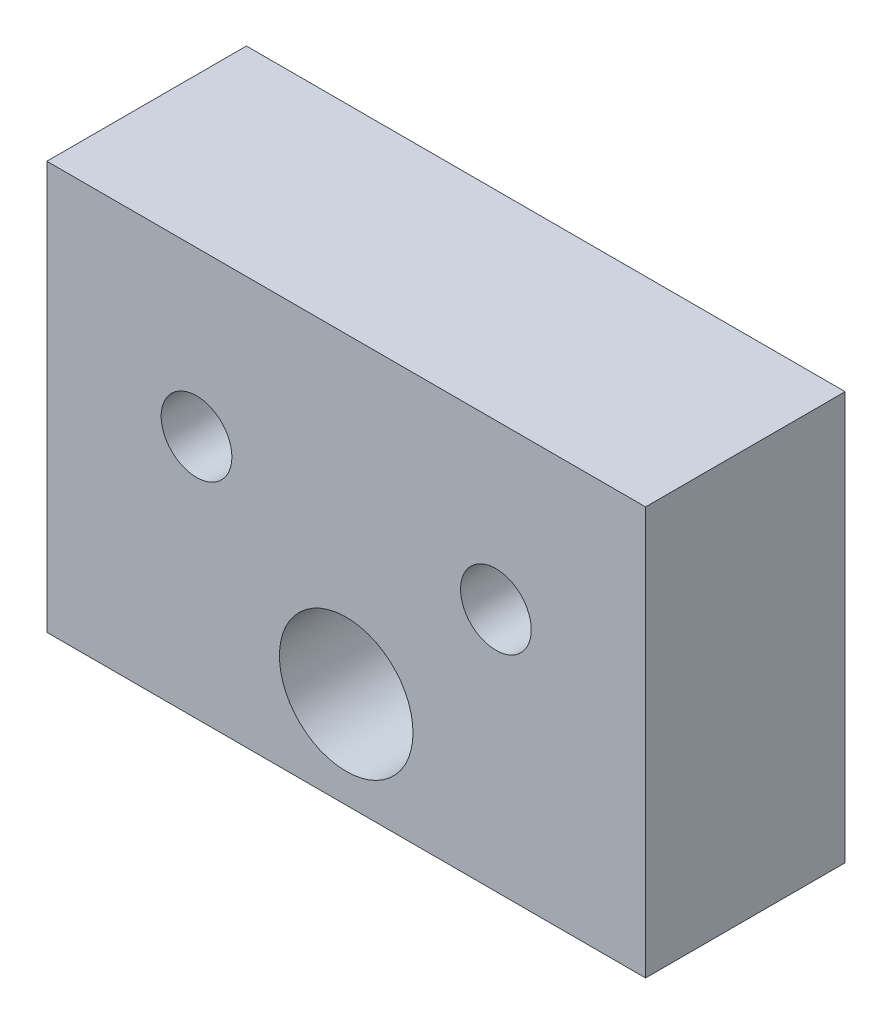
ISO-10303-21;
HEADER;
FILE_DESCRIPTION(('STEP AP214'),'2;1');
FILE_NAME('part.step','',(''),(''),'','','');
FILE_SCHEMA(('AUTOMOTIVE_DESIGN { 1 0 10303 214 1 1 1 1 }'));
ENDSEC;
DATA;
#1=APPLICATION_CONTEXT('core data for automotive mechanical design processes');
#2=APPLICATION_PROTOCOL_DEFINITION('international standard','automotive_design',2000,#1);
#3=PRODUCT_CONTEXT('',#1,'mechanical');
#4=PRODUCT('Part','Part','',(#3));
#5=PRODUCT_RELATED_PRODUCT_CATEGORY('part','',(#4));
#6=PRODUCT_DEFINITION_FORMATION('','',#4);
#7=PRODUCT_DEFINITION_CONTEXT('part definition',#1,'design');
#8=PRODUCT_DEFINITION('design','',#6,#7);
#9=PRODUCT_DEFINITION_SHAPE('','',#8);
#10=(LENGTH_UNIT() NAMED_UNIT(*) SI_UNIT(.MILLI.,.METRE.));
#11=(NAMED_UNIT(*) PLANE_ANGLE_UNIT() SI_UNIT($,.RADIAN.));
#12=(NAMED_UNIT(*) SI_UNIT($,.STERADIAN.) SOLID_ANGLE_UNIT());
#13=UNCERTAINTY_MEASURE_WITH_UNIT(LENGTH_MEASURE(1.E-05),#10,'distance_accuracy_value','');
#14=(GEOMETRIC_REPRESENTATION_CONTEXT(3) GLOBAL_UNCERTAINTY_ASSIGNED_CONTEXT((#13)) GLOBAL_UNIT_ASSIGNED_CONTEXT((#10,
#11,#12)) REPRESENTATION_CONTEXT('',''));
#15=CARTESIAN_POINT('',(0.,0.,0.));
#16=DIRECTION('',(0.,0.,1.));
#17=DIRECTION('',(1.,0.,0.));
#18=AXIS2_PLACEMENT_3D('',#15,#16,#17);
#19=CARTESIAN_POINT('',(0.,39.7023307712424,12.7));
#20=DIRECTION('',(0.,1.,0.));
#21=DIRECTION('',(0.,0.,1.));
#22=AXIS2_PLACEMENT_3D('',#19,#20,#21);
#23=PLANE('',#22);
#24=DIRECTION('',(1.,0.,0.));
#25=VECTOR('',#24,1.);
#26=CARTESIAN_POINT('',(0.,39.7023307712424,-12.7));
#27=LINE('',#26,#25);
#28=CARTESIAN_POINT('',(-38.1,39.7023307712424,-12.7));
#29=VERTEX_POINT('',#28);
#30=CARTESIAN_POINT('',(38.1,39.7023307712424,-12.7));
#31=VERTEX_POINT('',#30);
#32=EDGE_CURVE('E106',#29,#31,#27,.T.);
#33=ORIENTED_EDGE('',*,*,#32,.F.);
#34=DIRECTION('',(0.,0.,-1.));
#35=VECTOR('',#34,1.);
#36=CARTESIAN_POINT('',(-38.1,39.7023307712424,12.7));
#37=LINE('',#36,#35);
#38=CARTESIAN_POINT('',(-38.1,39.7023307712424,12.7));
#39=VERTEX_POINT('',#38);
#40=EDGE_CURVE('E11',#39,#29,#37,.T.);
#41=ORIENTED_EDGE('',*,*,#40,.F.);
#42=DIRECTION('',(1.,0.,0.));
#43=VECTOR('',#42,1.);
#44=CARTESIAN_POINT('',(0.,39.7023307712424,12.7));
#45=LINE('',#44,#43);
#46=CARTESIAN_POINT('',(38.1,39.7023307712424,12.7));
#47=VERTEX_POINT('',#46);
#48=EDGE_CURVE('E92',#39,#47,#45,.T.);
#49=ORIENTED_EDGE('',*,*,#48,.T.);
#50=DIRECTION('',(0.,0.,-1.));
#51=VECTOR('',#50,1.);
#52=CARTESIAN_POINT('',(38.1,39.7023307712424,12.7));
#53=LINE('',#52,#51);
#54=EDGE_CURVE('E74',#47,#31,#53,.T.);
#55=ORIENTED_EDGE('',*,*,#54,.T.);
#56=EDGE_LOOP('',(#33,#41,#49,#55));
#57=FACE_BOUND('',#56,.T.);
#58=ADVANCED_FACE('F35',(#57),#23,.T.);
#59=CARTESIAN_POINT('',(-38.1,0.,12.7));
#60=DIRECTION('',(1.,0.,0.));
#61=DIRECTION('',(0.,0.,-1.));
#62=AXIS2_PLACEMENT_3D('',#59,#60,#61);
#63=PLANE('',#62);
#64=DIRECTION('',(0.,-1.,0.));
#65=VECTOR('',#64,1.);
#66=CARTESIAN_POINT('',(-38.1,0.,-12.7));
#67=LINE('',#66,#65);
#68=CARTESIAN_POINT('',(-38.1,-12.224,-12.7));
#69=VERTEX_POINT('',#68);
#70=EDGE_CURVE('E97',#29,#69,#67,.T.);
#71=ORIENTED_EDGE('',*,*,#70,.T.);
#72=DIRECTION('',(0.,0.,-1.));
#73=VECTOR('',#72,1.);
#74=CARTESIAN_POINT('',(-38.1,-12.224,12.7));
#75=LINE('',#74,#73);
#76=CARTESIAN_POINT('',(-38.1,-12.224,12.7));
#77=VERTEX_POINT('',#76);
#78=EDGE_CURVE('E44',#77,#69,#75,.T.);
#79=ORIENTED_EDGE('',*,*,#78,.F.);
#80=DIRECTION('',(0.,-1.,0.));
#81=VECTOR('',#80,1.);
#82=CARTESIAN_POINT('',(-38.1,0.,12.7));
#83=LINE('',#82,#81);
#84=EDGE_CURVE('E89',#39,#77,#83,.T.);
#85=ORIENTED_EDGE('',*,*,#84,.F.);
#86=ORIENTED_EDGE('',*,*,#40,.T.);
#87=EDGE_LOOP('',(#71,#79,#85,#86));
#88=FACE_BOUND('',#87,.T.);
#89=ADVANCED_FACE('F95',(#88),#63,.F.);
#90=CARTESIAN_POINT('',(0.,-12.224,12.7));
#91=DIRECTION('',(0.,1.,0.));
#92=DIRECTION('',(0.,0.,1.));
#93=AXIS2_PLACEMENT_3D('',#90,#91,#92);
#94=PLANE('',#93);
#95=DIRECTION('',(1.,0.,0.));
#96=VECTOR('',#95,1.);
#97=CARTESIAN_POINT('',(0.,-12.224,-12.7));
#98=LINE('',#97,#96);
#99=CARTESIAN_POINT('',(38.1,-12.224,-12.7));
#100=VERTEX_POINT('',#99);
#101=EDGE_CURVE('E103',#69,#100,#98,.T.);
#102=ORIENTED_EDGE('',*,*,#101,.T.);
#103=DIRECTION('',(0.,0.,-1.));
#104=VECTOR('',#103,1.);
#105=CARTESIAN_POINT('',(38.1,-12.224,12.7));
#106=LINE('',#105,#104);
#107=CARTESIAN_POINT('',(38.1,-12.224,12.7));
#108=VERTEX_POINT('',#107);
#109=EDGE_CURVE('E88',#108,#100,#106,.T.);
#110=ORIENTED_EDGE('',*,*,#109,.F.);
#111=DIRECTION('',(1.,0.,0.));
#112=VECTOR('',#111,1.);
#113=CARTESIAN_POINT('',(0.,-12.224,12.7));
#114=LINE('',#113,#112);
#115=EDGE_CURVE('E82',#77,#108,#114,.T.);
#116=ORIENTED_EDGE('',*,*,#115,.F.);
#117=ORIENTED_EDGE('',*,*,#78,.T.);
#118=EDGE_LOOP('',(#102,#110,#116,#117));
#119=FACE_BOUND('',#118,.T.);
#120=ADVANCED_FACE('F85',(#119),#94,.F.);
#121=CARTESIAN_POINT('',(0.,0.,12.7));
#122=DIRECTION('',(0.,0.,-1.));
#123=DIRECTION('',(-1.,0.,0.));
#124=AXIS2_PLACEMENT_3D('',#121,#122,#123);
#125=CYLINDRICAL_SURFACE('',#124,8.5);
#126=CARTESIAN_POINT('',(0.,0.,12.7));
#127=DIRECTION('',(0.,0.,1.));
#128=DIRECTION('',(1.,0.,0.));
#129=AXIS2_PLACEMENT_3D('',#126,#127,#128);
#130=CIRCLE('',#129,8.5);
#131=CARTESIAN_POINT('',(8.5,0.,12.7));
#132=VERTEX_POINT('',#131);
#133=EDGE_CURVE('E119',#132,#132,#130,.T.);
#134=ORIENTED_EDGE('',*,*,#133,.T.);
#135=EDGE_LOOP('',(#134));
#136=FACE_BOUND('',#135,.T.);
#137=CARTESIAN_POINT('',(0.,0.,-12.7));
#138=DIRECTION('',(0.,0.,1.));
#139=DIRECTION('',(1.,0.,0.));
#140=AXIS2_PLACEMENT_3D('',#137,#138,#139);
#141=CIRCLE('',#140,8.5);
#142=CARTESIAN_POINT('',(8.5,0.,-12.7));
#143=VERTEX_POINT('',#142);
#144=EDGE_CURVE('E108',#143,#143,#141,.T.);
#145=ORIENTED_EDGE('',*,*,#144,.F.);
#146=EDGE_LOOP('',(#145));
#147=FACE_BOUND('',#146,.T.);
#148=ADVANCED_FACE('F139',(#136,#147),#125,.F.);
#149=CARTESIAN_POINT('',(19.05,18.8743307712424,12.7));
#150=DIRECTION('',(0.,0.,-1.));
#151=DIRECTION('',(-1.,0.,0.));
#152=AXIS2_PLACEMENT_3D('',#149,#150,#151);
#153=CYLINDRICAL_SURFACE('',#152,4.5);
#154=CARTESIAN_POINT('',(19.05,18.8743307712424,12.7));
#155=DIRECTION('',(0.,0.,1.));
#156=DIRECTION('',(1.,0.,0.));
#157=AXIS2_PLACEMENT_3D('',#154,#155,#156);
#158=CIRCLE('',#157,4.5);
#159=CARTESIAN_POINT('',(23.55,18.8743307712424,12.7));
#160=VERTEX_POINT('',#159);
#161=EDGE_CURVE('E122',#160,#160,#158,.T.);
#162=ORIENTED_EDGE('',*,*,#161,.T.);
#163=EDGE_LOOP('',(#162));
#164=FACE_BOUND('',#163,.T.);
#165=CARTESIAN_POINT('',(19.05,18.8743307712424,-12.7));
#166=DIRECTION('',(0.,0.,1.));
#167=DIRECTION('',(1.,0.,0.));
#168=AXIS2_PLACEMENT_3D('',#165,#166,#167);
#169=CIRCLE('',#168,4.5);
#170=CARTESIAN_POINT('',(23.55,18.8743307712424,-12.7));
#171=VERTEX_POINT('',#170);
#172=EDGE_CURVE('E111',#171,#171,#169,.T.);
#173=ORIENTED_EDGE('',*,*,#172,.F.);
#174=EDGE_LOOP('',(#173));
#175=FACE_BOUND('',#174,.T.);
#176=ADVANCED_FACE('F142',(#164,#175),#153,.F.);
#177=CARTESIAN_POINT('',(-19.05,18.8743307712424,12.7));
#178=DIRECTION('',(0.,0.,-1.));
#179=DIRECTION('',(-1.,0.,0.));
#180=AXIS2_PLACEMENT_3D('',#177,#178,#179);
#181=CYLINDRICAL_SURFACE('',#180,4.5);
#182=CARTESIAN_POINT('',(-19.05,18.8743307712424,12.7));
#183=DIRECTION('',(0.,0.,1.));
#184=DIRECTION('',(1.,0.,0.));
#185=AXIS2_PLACEMENT_3D('',#182,#183,#184);
#186=CIRCLE('',#185,4.5);
#187=CARTESIAN_POINT('',(-14.55,18.8743307712424,12.7));
#188=VERTEX_POINT('',#187);
#189=EDGE_CURVE('E102',#188,#188,#186,.T.);
#190=ORIENTED_EDGE('',*,*,#189,.T.);
#191=EDGE_LOOP('',(#190));
#192=FACE_BOUND('',#191,.T.);
#193=CARTESIAN_POINT('',(-19.05,18.8743307712424,-12.7));
#194=DIRECTION('',(0.,0.,1.));
#195=DIRECTION('',(1.,0.,0.));
#196=AXIS2_PLACEMENT_3D('',#193,#194,#195);
#197=CIRCLE('',#196,4.5);
#198=CARTESIAN_POINT('',(-14.55,18.8743307712424,-12.7));
#199=VERTEX_POINT('',#198);
#200=EDGE_CURVE('E114',#199,#199,#197,.T.);
#201=ORIENTED_EDGE('',*,*,#200,.F.);
#202=EDGE_LOOP('',(#201));
#203=FACE_BOUND('',#202,.T.);
#204=ADVANCED_FACE('F37',(#192,#203),#181,.F.);
#205=CARTESIAN_POINT('',(38.1,0.,12.7));
#206=DIRECTION('',(-1.,0.,0.));
#207=DIRECTION('',(0.,0.,1.));
#208=AXIS2_PLACEMENT_3D('',#205,#206,#207);
#209=PLANE('',#208);
#210=DIRECTION('',(0.,1.,0.));
#211=VECTOR('',#210,1.);
#212=CARTESIAN_POINT('',(38.1,0.,-12.7));
#213=LINE('',#212,#211);
#214=EDGE_CURVE('E67',#100,#31,#213,.T.);
#215=ORIENTED_EDGE('',*,*,#214,.T.);
#216=ORIENTED_EDGE('',*,*,#54,.F.);
#217=DIRECTION('',(0.,1.,0.));
#218=VECTOR('',#217,1.);
#219=CARTESIAN_POINT('',(38.1,0.,12.7));
#220=LINE('',#219,#218);
#221=EDGE_CURVE('E52',#108,#47,#220,.T.);
#222=ORIENTED_EDGE('',*,*,#221,.F.);
#223=ORIENTED_EDGE('',*,*,#109,.T.);
#224=EDGE_LOOP('',(#215,#216,#222,#223));
#225=FACE_BOUND('',#224,.T.);
#226=ADVANCED_FACE('F133',(#225),#209,.F.);
#227=CARTESIAN_POINT('',(0.,0.,12.7));
#228=DIRECTION('',(0.,0.,1.));
#229=DIRECTION('',(1.,0.,0.));
#230=AXIS2_PLACEMENT_3D('',#227,#228,#229);
#231=PLANE('',#230);
#232=ORIENTED_EDGE('',*,*,#189,.F.);
#233=EDGE_LOOP('',(#232));
#234=FACE_BOUND('',#233,.T.);
#235=ORIENTED_EDGE('',*,*,#161,.F.);
#236=EDGE_LOOP('',(#235));
#237=FACE_BOUND('',#236,.T.);
#238=ORIENTED_EDGE('',*,*,#133,.F.);
#239=EDGE_LOOP('',(#238));
#240=FACE_BOUND('',#239,.T.);
#241=ORIENTED_EDGE('',*,*,#48,.F.);
#242=ORIENTED_EDGE('',*,*,#84,.T.);
#243=ORIENTED_EDGE('',*,*,#115,.T.);
#244=ORIENTED_EDGE('',*,*,#221,.T.);
#245=EDGE_LOOP('',(#241,#242,#243,#244));
#246=FACE_BOUND('',#245,.T.);
#247=ADVANCED_FACE('F91',(#234,#237,#240,#246),#231,.T.);
#248=CARTESIAN_POINT('',(0.,0.,-12.7));
#249=DIRECTION('',(0.,0.,1.));
#250=DIRECTION('',(1.,0.,0.));
#251=AXIS2_PLACEMENT_3D('',#248,#249,#250);
#252=PLANE('',#251);
#253=ORIENTED_EDGE('',*,*,#200,.T.);
#254=EDGE_LOOP('',(#253));
#255=FACE_BOUND('',#254,.T.);
#256=ORIENTED_EDGE('',*,*,#172,.T.);
#257=EDGE_LOOP('',(#256));
#258=FACE_BOUND('',#257,.T.);
#259=ORIENTED_EDGE('',*,*,#144,.T.);
#260=EDGE_LOOP('',(#259));
#261=FACE_BOUND('',#260,.T.);
#262=ORIENTED_EDGE('',*,*,#32,.T.);
#263=ORIENTED_EDGE('',*,*,#214,.F.);
#264=ORIENTED_EDGE('',*,*,#101,.F.);
#265=ORIENTED_EDGE('',*,*,#70,.F.);
#266=EDGE_LOOP('',(#262,#263,#264,#265));
#267=FACE_BOUND('',#266,.T.);
#268=ADVANCED_FACE('F132',(#255,#258,#261,#267),#252,.F.);
#269=CLOSED_SHELL('',(#58,#89,#120,#148,#176,#204,#226,#247,#268));
#270=MANIFOLD_SOLID_BREP('B2',#269);
#271=ADVANCED_BREP_SHAPE_REPRESENTATION('',(#18,#270),#14);
#272=SHAPE_DEFINITION_REPRESENTATION(#9,#271);
ENDSEC;
END-ISO-10303-21;
